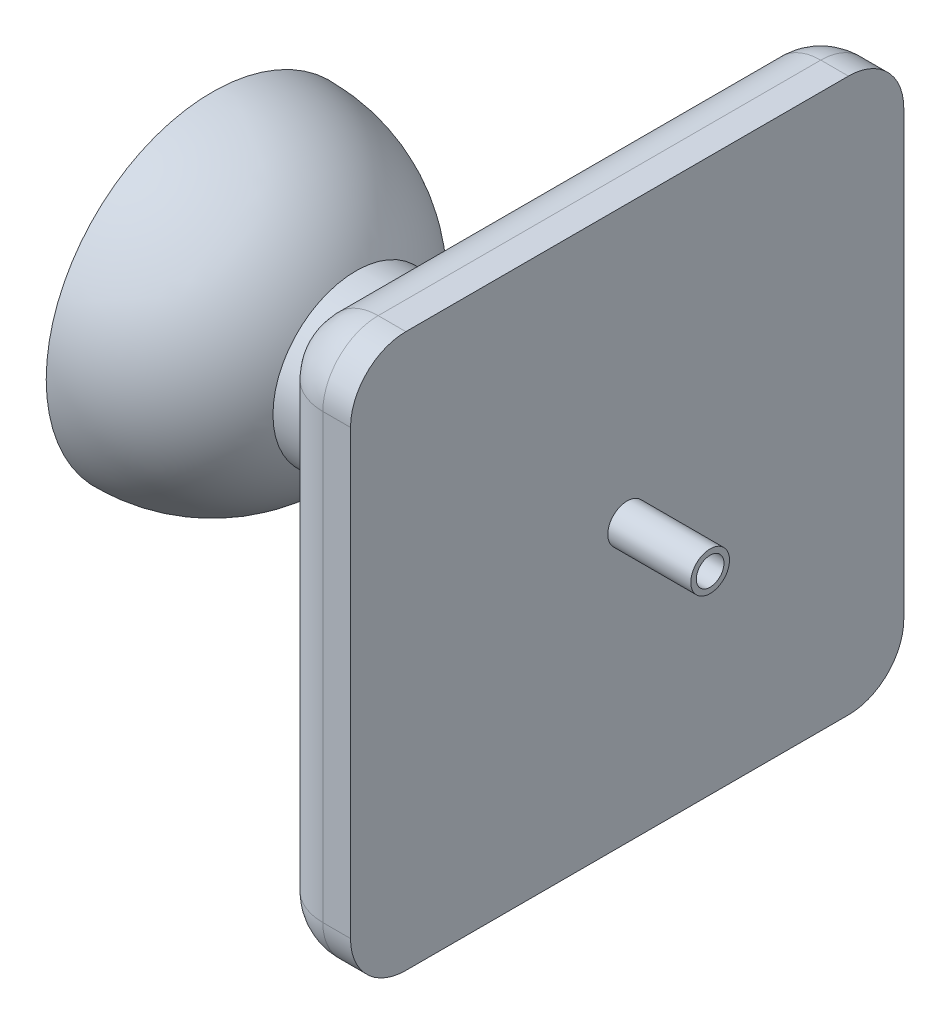
ISO-10303-21;
HEADER;
FILE_DESCRIPTION(('STEP AP214'),'2;1');
FILE_NAME('part.step','',(''),(''),'','','');
FILE_SCHEMA(('AUTOMOTIVE_DESIGN { 1 0 10303 214 1 1 1 1 }'));
ENDSEC;
DATA;
#1=APPLICATION_CONTEXT('core data for automotive mechanical design processes');
#2=APPLICATION_PROTOCOL_DEFINITION('international standard','automotive_design',2000,#1);
#3=PRODUCT_CONTEXT('',#1,'mechanical');
#4=PRODUCT('Part','Part','',(#3));
#5=PRODUCT_RELATED_PRODUCT_CATEGORY('part','',(#4));
#6=PRODUCT_DEFINITION_FORMATION('','',#4);
#7=PRODUCT_DEFINITION_CONTEXT('part definition',#1,'design');
#8=PRODUCT_DEFINITION('design','',#6,#7);
#9=PRODUCT_DEFINITION_SHAPE('','',#8);
#10=(LENGTH_UNIT() NAMED_UNIT(*) SI_UNIT(.MILLI.,.METRE.));
#11=(NAMED_UNIT(*) PLANE_ANGLE_UNIT() SI_UNIT($,.RADIAN.));
#12=(NAMED_UNIT(*) SI_UNIT($,.STERADIAN.) SOLID_ANGLE_UNIT());
#13=UNCERTAINTY_MEASURE_WITH_UNIT(LENGTH_MEASURE(1.E-05),#10,'distance_accuracy_value','');
#14=(GEOMETRIC_REPRESENTATION_CONTEXT(3) GLOBAL_UNCERTAINTY_ASSIGNED_CONTEXT((#13)) GLOBAL_UNIT_ASSIGNED_CONTEXT((#10,
#11,#12)) REPRESENTATION_CONTEXT('',''));
#15=CARTESIAN_POINT('',(0.,0.,0.));
#16=DIRECTION('',(0.,0.,1.));
#17=DIRECTION('',(1.,0.,0.));
#18=AXIS2_PLACEMENT_3D('',#15,#16,#17);
#19=CARTESIAN_POINT('',(0.,0.,0.));
#20=DIRECTION('',(-1.,0.,0.));
#21=DIRECTION('',(0.,1.,0.));
#22=AXIS2_PLACEMENT_3D('',#19,#20,#21);
#23=SPHERICAL_SURFACE('',#22,30.);
#24=CARTESIAN_POINT('',(0.,0.,0.));
#25=DIRECTION('',(-1.,0.,0.));
#26=DIRECTION('',(0.,0.,1.));
#27=AXIS2_PLACEMENT_3D('',#24,#25,#26);
#28=CIRCLE('',#27,30.);
#29=CARTESIAN_POINT('',(0.,0.,30.));
#30=VERTEX_POINT('',#29);
#31=EDGE_CURVE('E288',#30,#30,#28,.T.);
#32=ORIENTED_EDGE('',*,*,#31,.F.);
#33=EDGE_LOOP('',(#32));
#34=FACE_BOUND('',#33,.T.);
#35=CARTESIAN_POINT('',(25.9807621135332,0.,0.));
#36=DIRECTION('',(-1.,0.,0.));
#37=DIRECTION('',(0.,0.,1.));
#38=AXIS2_PLACEMENT_3D('',#35,#36,#37);
#39=CIRCLE('',#38,15.);
#40=CARTESIAN_POINT('',(25.9807621135332,0.,15.));
#41=VERTEX_POINT('',#40);
#42=EDGE_CURVE('E162',#41,#41,#39,.F.);
#43=ORIENTED_EDGE('',*,*,#42,.F.);
#44=EDGE_LOOP('',(#43));
#45=FACE_BOUND('',#44,.T.);
#46=ADVANCED_FACE('F49',(#34,#45),#23,.T.);
#47=CARTESIAN_POINT('',(0.,25.,0.));
#48=DIRECTION('',(-1.,0.,0.));
#49=DIRECTION('',(0.,0.,1.));
#50=AXIS2_PLACEMENT_3D('',#47,#48,#49);
#51=PLANE('',#50);
#52=ORIENTED_EDGE('',*,*,#31,.T.);
#53=EDGE_LOOP('',(#52));
#54=FACE_BOUND('',#53,.T.);
#55=CARTESIAN_POINT('',(0.,0.,0.));
#56=DIRECTION('',(-1.,0.,0.));
#57=DIRECTION('',(0.,0.,1.));
#58=AXIS2_PLACEMENT_3D('',#55,#56,#57);
#59=CIRCLE('',#58,25.);
#60=CARTESIAN_POINT('',(0.,0.,25.));
#61=VERTEX_POINT('',#60);
#62=EDGE_CURVE('E284',#61,#61,#59,.T.);
#63=ORIENTED_EDGE('',*,*,#62,.F.);
#64=EDGE_LOOP('',(#63));
#65=FACE_BOUND('',#64,.T.);
#66=ADVANCED_FACE('F299',(#54,#65),#51,.T.);
#67=CARTESIAN_POINT('',(0.,0.,0.));
#68=DIRECTION('',(-1.,0.,0.));
#69=DIRECTION('',(0.,1.,0.));
#70=AXIS2_PLACEMENT_3D('',#67,#68,#69);
#71=SPHERICAL_SURFACE('',#70,25.);
#72=ORIENTED_EDGE('',*,*,#62,.T.);
#73=EDGE_LOOP('',(#72));
#74=FACE_BOUND('',#73,.T.);
#75=ADVANCED_FACE('F307',(#74),#71,.F.);
#76=CARTESIAN_POINT('',(-30.001,0.,0.));
#77=DIRECTION('',(1.,0.,0.));
#78=DIRECTION('',(0.,0.,-1.));
#79=AXIS2_PLACEMENT_3D('',#76,#77,#78);
#80=CYLINDRICAL_SURFACE('',#79,15.);
#81=ORIENTED_EDGE('',*,*,#42,.T.);
#82=EDGE_LOOP('',(#81));
#83=FACE_BOUND('',#82,.T.);
#84=CARTESIAN_POINT('',(60.,0.,0.));
#85=DIRECTION('',(-1.,0.,0.));
#86=DIRECTION('',(0.,0.,1.));
#87=AXIS2_PLACEMENT_3D('',#84,#85,#86);
#88=CIRCLE('',#87,15.);
#89=CARTESIAN_POINT('',(60.,0.,15.));
#90=VERTEX_POINT('',#89);
#91=EDGE_CURVE('E276',#90,#90,#88,.T.);
#92=ORIENTED_EDGE('',*,*,#91,.T.);
#93=EDGE_LOOP('',(#92));
#94=FACE_BOUND('',#93,.T.);
#95=ADVANCED_FACE('F295',(#83,#94),#80,.T.);
#96=CARTESIAN_POINT('',(75.,-50.,-50.));
#97=DIRECTION('',(0.,0.,1.));
#98=DIRECTION('',(1.,0.,0.));
#99=AXIS2_PLACEMENT_3D('',#96,#97,#98);
#100=PLANE('',#99);
#101=DIRECTION('',(-1.,0.,0.));
#102=VECTOR('',#101,1.);
#103=CARTESIAN_POINT('',(75.,-40.,-50.));
#104=LINE('',#103,#102);
#105=CARTESIAN_POINT('',(75.,-40.,-50.));
#106=VERTEX_POINT('',#105);
#107=CARTESIAN_POINT('',(70.,-40.,-50.));
#108=VERTEX_POINT('',#107);
#109=EDGE_CURVE('E144',#106,#108,#104,.T.);
#110=ORIENTED_EDGE('',*,*,#109,.T.);
#111=DIRECTION('',(0.,1.,0.));
#112=VECTOR('',#111,1.);
#113=CARTESIAN_POINT('',(70.,40.,-50.));
#114=LINE('',#113,#112);
#115=CARTESIAN_POINT('',(70.,40.,-50.));
#116=VERTEX_POINT('',#115);
#117=EDGE_CURVE('E58',#108,#116,#114,.T.);
#118=ORIENTED_EDGE('',*,*,#117,.T.);
#119=DIRECTION('',(-1.,0.,0.));
#120=VECTOR('',#119,1.);
#121=CARTESIAN_POINT('',(75.,40.,-50.));
#122=LINE('',#121,#120);
#123=CARTESIAN_POINT('',(75.,40.,-50.));
#124=VERTEX_POINT('',#123);
#125=EDGE_CURVE('E145',#116,#124,#122,.F.);
#126=ORIENTED_EDGE('',*,*,#125,.T.);
#127=DIRECTION('',(0.,1.,0.));
#128=VECTOR('',#127,1.);
#129=CARTESIAN_POINT('',(75.,-50.,-50.));
#130=LINE('',#129,#128);
#131=EDGE_CURVE('E132',#106,#124,#130,.T.);
#132=ORIENTED_EDGE('',*,*,#131,.F.);
#133=EDGE_LOOP('',(#110,#118,#126,#132));
#134=FACE_BOUND('',#133,.T.);
#135=ADVANCED_FACE('F143',(#134),#100,.F.);
#136=CARTESIAN_POINT('',(75.,50.,50.));
#137=DIRECTION('',(0.,-1.,0.));
#138=DIRECTION('',(0.,0.,-1.));
#139=AXIS2_PLACEMENT_3D('',#136,#137,#138);
#140=PLANE('',#139);
#141=DIRECTION('',(-1.,0.,0.));
#142=VECTOR('',#141,1.);
#143=CARTESIAN_POINT('',(75.,50.,-40.));
#144=LINE('',#143,#142);
#145=CARTESIAN_POINT('',(75.,50.,-40.));
#146=VERTEX_POINT('',#145);
#147=CARTESIAN_POINT('',(70.,50.,-40.));
#148=VERTEX_POINT('',#147);
#149=EDGE_CURVE('E182',#146,#148,#144,.T.);
#150=ORIENTED_EDGE('',*,*,#149,.T.);
#151=DIRECTION('',(0.,0.,1.));
#152=VECTOR('',#151,1.);
#153=CARTESIAN_POINT('',(70.,50.,40.));
#154=LINE('',#153,#152);
#155=CARTESIAN_POINT('',(70.,50.,40.));
#156=VERTEX_POINT('',#155);
#157=EDGE_CURVE('E215',#148,#156,#154,.T.);
#158=ORIENTED_EDGE('',*,*,#157,.T.);
#159=DIRECTION('',(-1.,0.,0.));
#160=VECTOR('',#159,1.);
#161=CARTESIAN_POINT('',(75.,50.,40.));
#162=LINE('',#161,#160);
#163=CARTESIAN_POINT('',(75.,50.,40.));
#164=VERTEX_POINT('',#163);
#165=EDGE_CURVE('E185',#156,#164,#162,.F.);
#166=ORIENTED_EDGE('',*,*,#165,.T.);
#167=DIRECTION('',(0.,0.,1.));
#168=VECTOR('',#167,1.);
#169=CARTESIAN_POINT('',(75.,50.,50.));
#170=LINE('',#169,#168);
#171=EDGE_CURVE('E147',#146,#164,#170,.T.);
#172=ORIENTED_EDGE('',*,*,#171,.F.);
#173=EDGE_LOOP('',(#150,#158,#166,#172));
#174=FACE_BOUND('',#173,.T.);
#175=ADVANCED_FACE('F400',(#174),#140,.F.);
#176=CARTESIAN_POINT('',(75.,-50.,50.));
#177=DIRECTION('',(0.,0.,-1.));
#178=DIRECTION('',(-1.,0.,0.));
#179=AXIS2_PLACEMENT_3D('',#176,#177,#178);
#180=PLANE('',#179);
#181=DIRECTION('',(-1.,0.,0.));
#182=VECTOR('',#181,1.);
#183=CARTESIAN_POINT('',(75.,40.,50.));
#184=LINE('',#183,#182);
#185=CARTESIAN_POINT('',(75.,40.,50.));
#186=VERTEX_POINT('',#185);
#187=CARTESIAN_POINT('',(70.,40.,50.));
#188=VERTEX_POINT('',#187);
#189=EDGE_CURVE('E140',#186,#188,#184,.T.);
#190=ORIENTED_EDGE('',*,*,#189,.T.);
#191=DIRECTION('',(0.,-1.,0.));
#192=VECTOR('',#191,1.);
#193=CARTESIAN_POINT('',(70.,-40.,50.));
#194=LINE('',#193,#192);
#195=CARTESIAN_POINT('',(70.,-40.,50.));
#196=VERTEX_POINT('',#195);
#197=EDGE_CURVE('E209',#188,#196,#194,.T.);
#198=ORIENTED_EDGE('',*,*,#197,.T.);
#199=DIRECTION('',(-1.,0.,0.));
#200=VECTOR('',#199,1.);
#201=CARTESIAN_POINT('',(75.,-40.,50.));
#202=LINE('',#201,#200);
#203=CARTESIAN_POINT('',(75.,-40.,50.));
#204=VERTEX_POINT('',#203);
#205=EDGE_CURVE('E179',#196,#204,#202,.F.);
#206=ORIENTED_EDGE('',*,*,#205,.T.);
#207=DIRECTION('',(0.,-1.,0.));
#208=VECTOR('',#207,1.);
#209=CARTESIAN_POINT('',(75.,-50.,50.));
#210=LINE('',#209,#208);
#211=EDGE_CURVE('E270',#186,#204,#210,.T.);
#212=ORIENTED_EDGE('',*,*,#211,.F.);
#213=EDGE_LOOP('',(#190,#198,#206,#212));
#214=FACE_BOUND('',#213,.T.);
#215=ADVANCED_FACE('F267',(#214),#180,.F.);
#216=CARTESIAN_POINT('',(75.,-50.,50.));
#217=DIRECTION('',(0.,1.,0.));
#218=DIRECTION('',(0.,0.,1.));
#219=AXIS2_PLACEMENT_3D('',#216,#217,#218);
#220=PLANE('',#219);
#221=DIRECTION('',(-1.,0.,0.));
#222=VECTOR('',#221,1.);
#223=CARTESIAN_POINT('',(75.,-50.,40.));
#224=LINE('',#223,#222);
#225=CARTESIAN_POINT('',(75.,-50.,40.));
#226=VERTEX_POINT('',#225);
#227=CARTESIAN_POINT('',(70.,-50.,40.));
#228=VERTEX_POINT('',#227);
#229=EDGE_CURVE('E155',#226,#228,#224,.T.);
#230=ORIENTED_EDGE('',*,*,#229,.T.);
#231=DIRECTION('',(0.,0.,-1.));
#232=VECTOR('',#231,1.);
#233=CARTESIAN_POINT('',(70.,-50.,-40.));
#234=LINE('',#233,#232);
#235=CARTESIAN_POINT('',(70.,-50.,-40.));
#236=VERTEX_POINT('',#235);
#237=EDGE_CURVE('E190',#228,#236,#234,.T.);
#238=ORIENTED_EDGE('',*,*,#237,.T.);
#239=DIRECTION('',(-1.,0.,0.));
#240=VECTOR('',#239,1.);
#241=CARTESIAN_POINT('',(75.,-50.,-40.));
#242=LINE('',#241,#240);
#243=CARTESIAN_POINT('',(75.,-50.,-40.));
#244=VERTEX_POINT('',#243);
#245=EDGE_CURVE('E160',#236,#244,#242,.F.);
#246=ORIENTED_EDGE('',*,*,#245,.T.);
#247=DIRECTION('',(0.,0.,-1.));
#248=VECTOR('',#247,1.);
#249=CARTESIAN_POINT('',(75.,-50.,50.));
#250=LINE('',#249,#248);
#251=EDGE_CURVE('E135',#226,#244,#250,.T.);
#252=ORIENTED_EDGE('',*,*,#251,.F.);
#253=EDGE_LOOP('',(#230,#238,#246,#252));
#254=FACE_BOUND('',#253,.T.);
#255=ADVANCED_FACE('F388',(#254),#220,.F.);
#256=CARTESIAN_POINT('',(75.,0.,0.));
#257=DIRECTION('',(-1.,0.,0.));
#258=DIRECTION('',(0.,0.,1.));
#259=AXIS2_PLACEMENT_3D('',#256,#257,#258);
#260=PLANE('',#259);
#261=CARTESIAN_POINT('',(75.,0.,0.));
#262=DIRECTION('',(-1.,0.,0.));
#263=DIRECTION('',(0.,0.,1.));
#264=AXIS2_PLACEMENT_3D('',#261,#262,#263);
#265=CIRCLE('',#264,3.5);
#266=CARTESIAN_POINT('',(75.,0.,3.5));
#267=VERTEX_POINT('',#266);
#268=EDGE_CURVE('E11',#267,#267,#265,.F.);
#269=ORIENTED_EDGE('',*,*,#268,.F.);
#270=EDGE_LOOP('',(#269));
#271=FACE_BOUND('',#270,.T.);
#272=ORIENTED_EDGE('',*,*,#251,.T.);
#273=CARTESIAN_POINT('',(75.,-40.,-40.));
#274=DIRECTION('',(-1.,0.,0.));
#275=DIRECTION('',(0.,0.,1.));
#276=AXIS2_PLACEMENT_3D('',#273,#274,#275);
#277=CIRCLE('',#276,10.);
#278=EDGE_CURVE('E129',#244,#106,#277,.F.);
#279=ORIENTED_EDGE('',*,*,#278,.T.);
#280=ORIENTED_EDGE('',*,*,#131,.T.);
#281=CARTESIAN_POINT('',(75.,40.,-40.));
#282=DIRECTION('',(-1.,0.,0.));
#283=DIRECTION('',(0.,0.,1.));
#284=AXIS2_PLACEMENT_3D('',#281,#282,#283);
#285=CIRCLE('',#284,10.);
#286=EDGE_CURVE('E168',#124,#146,#285,.F.);
#287=ORIENTED_EDGE('',*,*,#286,.T.);
#288=ORIENTED_EDGE('',*,*,#171,.T.);
#289=CARTESIAN_POINT('',(75.,40.,40.));
#290=DIRECTION('',(-1.,0.,0.));
#291=DIRECTION('',(0.,0.,1.));
#292=AXIS2_PLACEMENT_3D('',#289,#290,#291);
#293=CIRCLE('',#292,10.);
#294=EDGE_CURVE('E171',#164,#186,#293,.F.);
#295=ORIENTED_EDGE('',*,*,#294,.T.);
#296=ORIENTED_EDGE('',*,*,#211,.T.);
#297=CARTESIAN_POINT('',(75.,-40.,40.));
#298=DIRECTION('',(-1.,0.,0.));
#299=DIRECTION('',(0.,0.,1.));
#300=AXIS2_PLACEMENT_3D('',#297,#298,#299);
#301=CIRCLE('',#300,10.);
#302=EDGE_CURVE('E141',#204,#226,#301,.F.);
#303=ORIENTED_EDGE('',*,*,#302,.T.);
#304=EDGE_LOOP('',(#272,#279,#280,#287,#288,#295,#296,#303));
#305=FACE_BOUND('',#304,.T.);
#306=ADVANCED_FACE('F131',(#271,#305),#260,.F.);
#307=CARTESIAN_POINT('',(60.,0.,0.));
#308=DIRECTION('',(-1.,0.,0.));
#309=DIRECTION('',(0.,0.,1.));
#310=AXIS2_PLACEMENT_3D('',#307,#308,#309);
#311=PLANE('',#310);
#312=DIRECTION('',(0.,1.,0.));
#313=VECTOR('',#312,1.);
#314=CARTESIAN_POINT('',(60.,-40.,-40.));
#315=LINE('',#314,#313);
#316=CARTESIAN_POINT('',(60.,40.,-40.));
#317=VERTEX_POINT('',#316);
#318=CARTESIAN_POINT('',(60.,-40.,-40.));
#319=VERTEX_POINT('',#318);
#320=EDGE_CURVE('E193',#317,#319,#315,.F.);
#321=ORIENTED_EDGE('',*,*,#320,.T.);
#322=DIRECTION('',(0.,0.,-1.));
#323=VECTOR('',#322,1.);
#324=CARTESIAN_POINT('',(60.,-40.,40.));
#325=LINE('',#324,#323);
#326=CARTESIAN_POINT('',(60.,-40.,40.));
#327=VERTEX_POINT('',#326);
#328=EDGE_CURVE('E202',#319,#327,#325,.F.);
#329=ORIENTED_EDGE('',*,*,#328,.T.);
#330=DIRECTION('',(0.,-1.,0.));
#331=VECTOR('',#330,1.);
#332=CARTESIAN_POINT('',(60.,40.,40.));
#333=LINE('',#332,#331);
#334=CARTESIAN_POINT('',(60.,40.,40.));
#335=VERTEX_POINT('',#334);
#336=EDGE_CURVE('E199',#327,#335,#333,.F.);
#337=ORIENTED_EDGE('',*,*,#336,.T.);
#338=DIRECTION('',(0.,0.,1.));
#339=VECTOR('',#338,1.);
#340=CARTESIAN_POINT('',(60.,40.,-40.));
#341=LINE('',#340,#339);
#342=EDGE_CURVE('E196',#335,#317,#341,.F.);
#343=ORIENTED_EDGE('',*,*,#342,.T.);
#344=EDGE_LOOP('',(#321,#329,#337,#343));
#345=FACE_BOUND('',#344,.T.);
#346=ORIENTED_EDGE('',*,*,#91,.F.);
#347=EDGE_LOOP('',(#346));
#348=FACE_BOUND('',#347,.T.);
#349=ADVANCED_FACE('F316',(#345,#348),#311,.T.);
#350=CARTESIAN_POINT('',(75.,-40.,-40.));
#351=DIRECTION('',(-1.,0.,0.));
#352=DIRECTION('',(0.,0.,1.));
#353=AXIS2_PLACEMENT_3D('',#350,#351,#352);
#354=CYLINDRICAL_SURFACE('',#353,10.);
#355=ORIENTED_EDGE('',*,*,#245,.F.);
#356=CARTESIAN_POINT('',(70.,-40.,-40.));
#357=DIRECTION('',(-1.,0.,0.));
#358=DIRECTION('',(0.,0.,1.));
#359=AXIS2_PLACEMENT_3D('',#356,#357,#358);
#360=CIRCLE('',#359,10.);
#361=EDGE_CURVE('E153',#236,#108,#360,.F.);
#362=ORIENTED_EDGE('',*,*,#361,.T.);
#363=ORIENTED_EDGE('',*,*,#109,.F.);
#364=ORIENTED_EDGE('',*,*,#278,.F.);
#365=EDGE_LOOP('',(#355,#362,#363,#364));
#366=FACE_BOUND('',#365,.T.);
#367=ADVANCED_FACE('F151',(#366),#354,.T.);
#368=CARTESIAN_POINT('',(75.,-40.,40.));
#369=DIRECTION('',(-1.,0.,0.));
#370=DIRECTION('',(0.,0.,1.));
#371=AXIS2_PLACEMENT_3D('',#368,#369,#370);
#372=CYLINDRICAL_SURFACE('',#371,10.);
#373=ORIENTED_EDGE('',*,*,#205,.F.);
#374=CARTESIAN_POINT('',(70.,-40.,40.));
#375=DIRECTION('',(-1.,0.,0.));
#376=DIRECTION('',(0.,0.,1.));
#377=AXIS2_PLACEMENT_3D('',#374,#375,#376);
#378=CIRCLE('',#377,10.);
#379=EDGE_CURVE('E206',#196,#228,#378,.F.);
#380=ORIENTED_EDGE('',*,*,#379,.T.);
#381=ORIENTED_EDGE('',*,*,#229,.F.);
#382=ORIENTED_EDGE('',*,*,#302,.F.);
#383=EDGE_LOOP('',(#373,#380,#381,#382));
#384=FACE_BOUND('',#383,.T.);
#385=ADVANCED_FACE('F315',(#384),#372,.T.);
#386=CARTESIAN_POINT('',(75.,40.,40.));
#387=DIRECTION('',(-1.,0.,0.));
#388=DIRECTION('',(0.,0.,1.));
#389=AXIS2_PLACEMENT_3D('',#386,#387,#388);
#390=CYLINDRICAL_SURFACE('',#389,10.);
#391=ORIENTED_EDGE('',*,*,#165,.F.);
#392=CARTESIAN_POINT('',(70.,40.,40.));
#393=DIRECTION('',(-1.,0.,0.));
#394=DIRECTION('',(0.,0.,1.));
#395=AXIS2_PLACEMENT_3D('',#392,#393,#394);
#396=CIRCLE('',#395,10.);
#397=EDGE_CURVE('E212',#156,#188,#396,.F.);
#398=ORIENTED_EDGE('',*,*,#397,.T.);
#399=ORIENTED_EDGE('',*,*,#189,.F.);
#400=ORIENTED_EDGE('',*,*,#294,.F.);
#401=EDGE_LOOP('',(#391,#398,#399,#400));
#402=FACE_BOUND('',#401,.T.);
#403=ADVANCED_FACE('F263',(#402),#390,.T.);
#404=CARTESIAN_POINT('',(75.,40.,-40.));
#405=DIRECTION('',(-1.,0.,0.));
#406=DIRECTION('',(0.,0.,1.));
#407=AXIS2_PLACEMENT_3D('',#404,#405,#406);
#408=CYLINDRICAL_SURFACE('',#407,10.);
#409=ORIENTED_EDGE('',*,*,#125,.F.);
#410=CARTESIAN_POINT('',(70.,40.,-40.));
#411=DIRECTION('',(-1.,0.,0.));
#412=DIRECTION('',(0.,0.,1.));
#413=AXIS2_PLACEMENT_3D('',#410,#411,#412);
#414=CIRCLE('',#413,10.);
#415=EDGE_CURVE('E71',#116,#148,#414,.F.);
#416=ORIENTED_EDGE('',*,*,#415,.T.);
#417=ORIENTED_EDGE('',*,*,#149,.F.);
#418=ORIENTED_EDGE('',*,*,#286,.F.);
#419=EDGE_LOOP('',(#409,#416,#417,#418));
#420=FACE_BOUND('',#419,.T.);
#421=ADVANCED_FACE('F322',(#420),#408,.T.);
#422=CARTESIAN_POINT('',(70.,40.,40.));
#423=DIRECTION('',(-1.,0.,0.));
#424=DIRECTION('',(0.,0.,1.));
#425=AXIS2_PLACEMENT_3D('',#422,#423,#424);
#426=SPHERICAL_SURFACE('',#425,10.);
#427=CARTESIAN_POINT('',(70.,40.,40.));
#428=DIRECTION('',(0.,-1.,0.));
#429=DIRECTION('',(0.,0.,-1.));
#430=AXIS2_PLACEMENT_3D('',#427,#428,#429);
#431=CIRCLE('',#430,10.);
#432=EDGE_CURVE('E245',#188,#335,#431,.T.);
#433=ORIENTED_EDGE('',*,*,#432,.F.);
#434=ORIENTED_EDGE('',*,*,#397,.F.);
#435=CARTESIAN_POINT('',(70.,40.,40.));
#436=DIRECTION('',(0.,0.,-1.));
#437=DIRECTION('',(-1.,0.,0.));
#438=AXIS2_PLACEMENT_3D('',#435,#436,#437);
#439=CIRCLE('',#438,10.);
#440=EDGE_CURVE('E148',#335,#156,#439,.T.);
#441=ORIENTED_EDGE('',*,*,#440,.F.);
#442=EDGE_LOOP('',(#433,#434,#441));
#443=FACE_BOUND('',#442,.T.);
#444=ADVANCED_FACE('F51',(#443),#426,.T.);
#445=CARTESIAN_POINT('',(70.,40.,50.));
#446=DIRECTION('',(0.,0.,-1.));
#447=DIRECTION('',(-1.,0.,0.));
#448=AXIS2_PLACEMENT_3D('',#445,#446,#447);
#449=CYLINDRICAL_SURFACE('',#448,10.);
#450=ORIENTED_EDGE('',*,*,#440,.T.);
#451=ORIENTED_EDGE('',*,*,#157,.F.);
#452=CARTESIAN_POINT('',(70.,40.,-40.));
#453=DIRECTION('',(0.,0.,-1.));
#454=DIRECTION('',(-1.,0.,0.));
#455=AXIS2_PLACEMENT_3D('',#452,#453,#454);
#456=CIRCLE('',#455,10.);
#457=EDGE_CURVE('E241',#317,#148,#456,.T.);
#458=ORIENTED_EDGE('',*,*,#457,.F.);
#459=ORIENTED_EDGE('',*,*,#342,.F.);
#460=EDGE_LOOP('',(#450,#451,#458,#459));
#461=FACE_BOUND('',#460,.T.);
#462=ADVANCED_FACE('F254',(#461),#449,.T.);
#463=CARTESIAN_POINT('',(70.,-50.,40.));
#464=DIRECTION('',(0.,1.,0.));
#465=DIRECTION('',(0.,0.,1.));
#466=AXIS2_PLACEMENT_3D('',#463,#464,#465);
#467=CYLINDRICAL_SURFACE('',#466,10.);
#468=ORIENTED_EDGE('',*,*,#432,.T.);
#469=ORIENTED_EDGE('',*,*,#336,.F.);
#470=CARTESIAN_POINT('',(70.,-40.,40.));
#471=DIRECTION('',(0.,-1.,0.));
#472=DIRECTION('',(0.,0.,-1.));
#473=AXIS2_PLACEMENT_3D('',#470,#471,#472);
#474=CIRCLE('',#473,10.);
#475=EDGE_CURVE('E237',#196,#327,#474,.T.);
#476=ORIENTED_EDGE('',*,*,#475,.F.);
#477=ORIENTED_EDGE('',*,*,#197,.F.);
#478=EDGE_LOOP('',(#468,#469,#476,#477));
#479=FACE_BOUND('',#478,.T.);
#480=ADVANCED_FACE('F345',(#479),#467,.T.);
#481=CARTESIAN_POINT('',(70.,40.,-40.));
#482=DIRECTION('',(-1.,0.,0.));
#483=DIRECTION('',(0.,0.,1.));
#484=AXIS2_PLACEMENT_3D('',#481,#482,#483);
#485=SPHERICAL_SURFACE('',#484,10.);
#486=ORIENTED_EDGE('',*,*,#457,.T.);
#487=ORIENTED_EDGE('',*,*,#415,.F.);
#488=CARTESIAN_POINT('',(70.,40.,-40.));
#489=DIRECTION('',(0.,-1.,0.));
#490=DIRECTION('',(0.,0.,-1.));
#491=AXIS2_PLACEMENT_3D('',#488,#489,#490);
#492=CIRCLE('',#491,10.);
#493=EDGE_CURVE('E233',#317,#116,#492,.T.);
#494=ORIENTED_EDGE('',*,*,#493,.F.);
#495=EDGE_LOOP('',(#486,#487,#494));
#496=FACE_BOUND('',#495,.T.);
#497=ADVANCED_FACE('F341',(#496),#485,.T.);
#498=CARTESIAN_POINT('',(70.,-40.,40.));
#499=DIRECTION('',(-1.,0.,0.));
#500=DIRECTION('',(0.,0.,1.));
#501=AXIS2_PLACEMENT_3D('',#498,#499,#500);
#502=SPHERICAL_SURFACE('',#501,10.);
#503=ORIENTED_EDGE('',*,*,#379,.F.);
#504=ORIENTED_EDGE('',*,*,#475,.T.);
#505=CARTESIAN_POINT('',(70.,-40.,40.));
#506=DIRECTION('',(0.,0.,-1.));
#507=DIRECTION('',(-1.,0.,0.));
#508=AXIS2_PLACEMENT_3D('',#505,#506,#507);
#509=CIRCLE('',#508,10.);
#510=EDGE_CURVE('E230',#228,#327,#509,.T.);
#511=ORIENTED_EDGE('',*,*,#510,.F.);
#512=EDGE_LOOP('',(#503,#504,#511));
#513=FACE_BOUND('',#512,.T.);
#514=ADVANCED_FACE('F337',(#513),#502,.T.);
#515=CARTESIAN_POINT('',(70.,-50.,-40.));
#516=DIRECTION('',(0.,-1.,0.));
#517=DIRECTION('',(0.,0.,-1.));
#518=AXIS2_PLACEMENT_3D('',#515,#516,#517);
#519=CYLINDRICAL_SURFACE('',#518,10.);
#520=ORIENTED_EDGE('',*,*,#493,.T.);
#521=ORIENTED_EDGE('',*,*,#117,.F.);
#522=CARTESIAN_POINT('',(70.,-40.,-40.));
#523=DIRECTION('',(0.,-1.,0.));
#524=DIRECTION('',(0.,0.,-1.));
#525=AXIS2_PLACEMENT_3D('',#522,#523,#524);
#526=CIRCLE('',#525,10.);
#527=EDGE_CURVE('E226',#319,#108,#526,.T.);
#528=ORIENTED_EDGE('',*,*,#527,.F.);
#529=ORIENTED_EDGE('',*,*,#320,.F.);
#530=EDGE_LOOP('',(#520,#521,#528,#529));
#531=FACE_BOUND('',#530,.T.);
#532=ADVANCED_FACE('F333',(#531),#519,.T.);
#533=CARTESIAN_POINT('',(70.,-40.,50.));
#534=DIRECTION('',(0.,0.,1.));
#535=DIRECTION('',(1.,0.,0.));
#536=AXIS2_PLACEMENT_3D('',#533,#534,#535);
#537=CYLINDRICAL_SURFACE('',#536,10.);
#538=ORIENTED_EDGE('',*,*,#510,.T.);
#539=ORIENTED_EDGE('',*,*,#328,.F.);
#540=CARTESIAN_POINT('',(70.,-40.,-40.));
#541=DIRECTION('',(0.,0.,-1.));
#542=DIRECTION('',(-1.,0.,0.));
#543=AXIS2_PLACEMENT_3D('',#540,#541,#542);
#544=CIRCLE('',#543,10.);
#545=EDGE_CURVE('E222',#236,#319,#544,.T.);
#546=ORIENTED_EDGE('',*,*,#545,.F.);
#547=ORIENTED_EDGE('',*,*,#237,.F.);
#548=EDGE_LOOP('',(#538,#539,#546,#547));
#549=FACE_BOUND('',#548,.T.);
#550=ADVANCED_FACE('F329',(#549),#537,.T.);
#551=CARTESIAN_POINT('',(70.,-40.,-40.));
#552=DIRECTION('',(-1.,0.,0.));
#553=DIRECTION('',(0.,0.,1.));
#554=AXIS2_PLACEMENT_3D('',#551,#552,#553);
#555=SPHERICAL_SURFACE('',#554,10.);
#556=ORIENTED_EDGE('',*,*,#527,.T.);
#557=ORIENTED_EDGE('',*,*,#361,.F.);
#558=ORIENTED_EDGE('',*,*,#545,.T.);
#559=EDGE_LOOP('',(#556,#557,#558));
#560=FACE_BOUND('',#559,.T.);
#561=ADVANCED_FACE('F325',(#560),#555,.T.);
#562=CARTESIAN_POINT('',(90.,0.,0.));
#563=DIRECTION('',(1.,0.,0.));
#564=DIRECTION('',(0.,0.,-1.));
#565=AXIS2_PLACEMENT_3D('',#562,#563,#564);
#566=PLANE('',#565);
#567=CARTESIAN_POINT('',(90.,0.,0.));
#568=DIRECTION('',(1.,0.,0.));
#569=DIRECTION('',(0.,0.,-1.));
#570=AXIS2_PLACEMENT_3D('',#567,#568,#569);
#571=CIRCLE('',#570,3.5);
#572=CARTESIAN_POINT('',(90.,0.,-3.5));
#573=VERTEX_POINT('',#572);
#574=EDGE_CURVE('E227',#573,#573,#571,.T.);
#575=ORIENTED_EDGE('',*,*,#574,.T.);
#576=EDGE_LOOP('',(#575));
#577=FACE_BOUND('',#576,.T.);
#578=CARTESIAN_POINT('',(90.,0.,0.));
#579=DIRECTION('',(1.,0.,0.));
#580=DIRECTION('',(0.,0.,-1.));
#581=AXIS2_PLACEMENT_3D('',#578,#579,#580);
#582=CIRCLE('',#581,2.5);
#583=CARTESIAN_POINT('',(90.,0.,-2.5));
#584=VERTEX_POINT('',#583);
#585=EDGE_CURVE('E465',#584,#584,#582,.T.);
#586=ORIENTED_EDGE('',*,*,#585,.F.);
#587=EDGE_LOOP('',(#586));
#588=FACE_BOUND('',#587,.T.);
#589=ADVANCED_FACE('F328',(#577,#588),#566,.T.);
#590=CARTESIAN_POINT('',(90.,0.,0.));
#591=DIRECTION('',(-1.,0.,0.));
#592=DIRECTION('',(0.,0.,1.));
#593=AXIS2_PLACEMENT_3D('',#590,#591,#592);
#594=CYLINDRICAL_SURFACE('',#593,3.5);
#595=ORIENTED_EDGE('',*,*,#574,.F.);
#596=EDGE_LOOP('',(#595));
#597=FACE_BOUND('',#596,.T.);
#598=ORIENTED_EDGE('',*,*,#268,.T.);
#599=EDGE_LOOP('',(#598));
#600=FACE_BOUND('',#599,.T.);
#601=ADVANCED_FACE('F448',(#597,#600),#594,.T.);
#602=CARTESIAN_POINT('',(90.,0.,0.));
#603=DIRECTION('',(-1.,0.,0.));
#604=DIRECTION('',(0.,0.,1.));
#605=AXIS2_PLACEMENT_3D('',#602,#603,#604);
#606=CYLINDRICAL_SURFACE('',#605,2.5);
#607=ORIENTED_EDGE('',*,*,#585,.T.);
#608=EDGE_LOOP('',(#607));
#609=FACE_BOUND('',#608,.T.);
#610=CARTESIAN_POINT('',(75.,0.,0.));
#611=DIRECTION('',(1.,0.,0.));
#612=DIRECTION('',(0.,0.,-1.));
#613=AXIS2_PLACEMENT_3D('',#610,#611,#612);
#614=CIRCLE('',#613,2.5);
#615=CARTESIAN_POINT('',(75.,0.,-2.5));
#616=VERTEX_POINT('',#615);
#617=EDGE_CURVE('E468',#616,#616,#614,.T.);
#618=ORIENTED_EDGE('',*,*,#617,.F.);
#619=EDGE_LOOP('',(#618));
#620=FACE_BOUND('',#619,.T.);
#621=ADVANCED_FACE('F451',(#609,#620),#606,.F.);
#622=ORIENTED_EDGE('',*,*,#617,.T.);
#623=EDGE_LOOP('',(#622));
#624=FACE_BOUND('',#623,.T.);
#625=ADVANCED_FACE('F447',(#624),#260,.F.);
#626=CLOSED_SHELL('',(#46,#66,#75,#95,#135,#175,#215,#255,#306,#349,#367,#385,#403,#421,#444,
#462,#480,#497,#514,#532,#550,#561,#589,#601,#621,#625));
#627=MANIFOLD_SOLID_BREP('B2',#626);
#628=ADVANCED_BREP_SHAPE_REPRESENTATION('',(#18,#627),#14);
#629=SHAPE_DEFINITION_REPRESENTATION(#9,#628);
ENDSEC;
END-ISO-10303-21;
